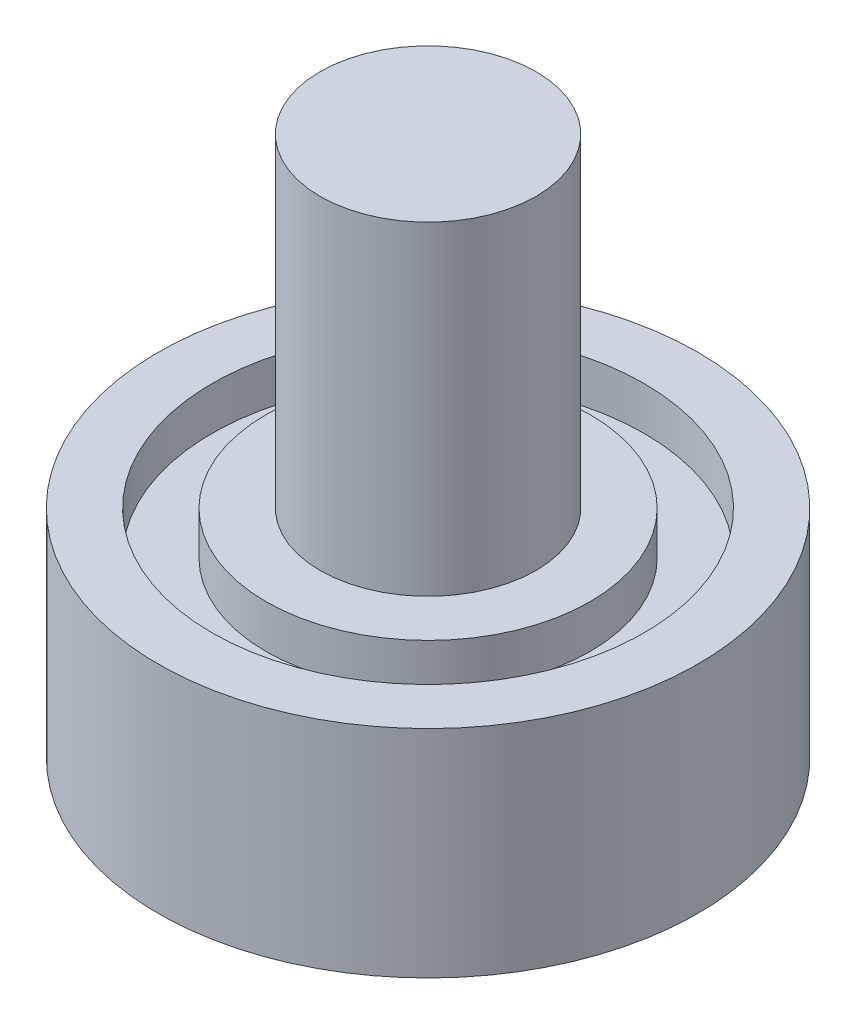
ISO-10303-21;
HEADER;
FILE_DESCRIPTION(('STEP AP214'),'2;1');
FILE_NAME('part.step','',(''),(''),'','','');
FILE_SCHEMA(('AUTOMOTIVE_DESIGN { 1 0 10303 214 1 1 1 1 }'));
ENDSEC;
DATA;
#1=APPLICATION_CONTEXT('core data for automotive mechanical design processes');
#2=APPLICATION_PROTOCOL_DEFINITION('international standard','automotive_design',2000,#1);
#3=PRODUCT_CONTEXT('',#1,'mechanical');
#4=PRODUCT('Part','Part','',(#3));
#5=PRODUCT_RELATED_PRODUCT_CATEGORY('part','',(#4));
#6=PRODUCT_DEFINITION_FORMATION('','',#4);
#7=PRODUCT_DEFINITION_CONTEXT('part definition',#1,'design');
#8=PRODUCT_DEFINITION('design','',#6,#7);
#9=PRODUCT_DEFINITION_SHAPE('','',#8);
#10=(LENGTH_UNIT() NAMED_UNIT(*) SI_UNIT(.MILLI.,.METRE.));
#11=(NAMED_UNIT(*) PLANE_ANGLE_UNIT() SI_UNIT($,.RADIAN.));
#12=(NAMED_UNIT(*) SI_UNIT($,.STERADIAN.) SOLID_ANGLE_UNIT());
#13=UNCERTAINTY_MEASURE_WITH_UNIT(LENGTH_MEASURE(1.E-05),#10,'distance_accuracy_value','');
#14=(GEOMETRIC_REPRESENTATION_CONTEXT(3) GLOBAL_UNCERTAINTY_ASSIGNED_CONTEXT((#13)) GLOBAL_UNIT_ASSIGNED_CONTEXT((#10,
#11,#12)) REPRESENTATION_CONTEXT('',''));
#15=CARTESIAN_POINT('',(0.,0.,0.));
#16=DIRECTION('',(0.,0.,1.));
#17=DIRECTION('',(1.,0.,0.));
#18=AXIS2_PLACEMENT_3D('',#15,#16,#17);
#19=CARTESIAN_POINT('',(0.,29.,0.));
#20=DIRECTION('',(0.,1.,0.));
#21=DIRECTION('',(0.,0.,1.));
#22=AXIS2_PLACEMENT_3D('',#19,#20,#21);
#23=PLANE('',#22);
#24=CARTESIAN_POINT('',(0.,29.,0.));
#25=DIRECTION('',(0.,-1.,0.));
#26=DIRECTION('',(0.,0.,-1.));
#27=AXIS2_PLACEMENT_3D('',#24,#25,#26);
#28=CIRCLE('',#27,5.);
#29=CARTESIAN_POINT('',(0.,29.,-5.));
#30=VERTEX_POINT('',#29);
#31=EDGE_CURVE('E37',#30,#30,#28,.T.);
#32=ORIENTED_EDGE('',*,*,#31,.F.);
#33=EDGE_LOOP('',(#32));
#34=FACE_BOUND('',#33,.T.);
#35=ADVANCED_FACE('F31',(#34),#23,.T.);
#36=CARTESIAN_POINT('',(0.,0.,0.));
#37=DIRECTION('',(0.,-1.,0.));
#38=DIRECTION('',(0.,0.,-1.));
#39=AXIS2_PLACEMENT_3D('',#36,#37,#38);
#40=CYLINDRICAL_SURFACE('',#39,5.);
#41=ORIENTED_EDGE('',*,*,#31,.T.);
#42=EDGE_LOOP('',(#41));
#43=FACE_BOUND('',#42,.T.);
#44=CARTESIAN_POINT('',(0.,14.,0.));
#45=DIRECTION('',(0.,-1.,0.));
#46=DIRECTION('',(0.,0.,-1.));
#47=AXIS2_PLACEMENT_3D('',#44,#45,#46);
#48=CIRCLE('',#47,5.);
#49=CARTESIAN_POINT('',(0.,14.,-5.));
#50=VERTEX_POINT('',#49);
#51=EDGE_CURVE('E41',#50,#50,#48,.T.);
#52=ORIENTED_EDGE('',*,*,#51,.F.);
#53=EDGE_LOOP('',(#52));
#54=FACE_BOUND('',#53,.T.);
#55=ADVANCED_FACE('F113',(#43,#54),#40,.T.);
#56=CARTESIAN_POINT('',(7.5,14.,0.));
#57=DIRECTION('',(0.,1.,0.));
#58=DIRECTION('',(0.,0.,1.));
#59=AXIS2_PLACEMENT_3D('',#56,#57,#58);
#60=PLANE('',#59);
#61=ORIENTED_EDGE('',*,*,#51,.T.);
#62=EDGE_LOOP('',(#61));
#63=FACE_BOUND('',#62,.T.);
#64=CARTESIAN_POINT('',(0.,14.,0.));
#65=DIRECTION('',(0.,-1.,0.));
#66=DIRECTION('',(0.,0.,-1.));
#67=AXIS2_PLACEMENT_3D('',#64,#65,#66);
#68=CIRCLE('',#67,7.5);
#69=CARTESIAN_POINT('',(0.,14.,-7.5));
#70=VERTEX_POINT('',#69);
#71=EDGE_CURVE('E45',#70,#70,#68,.T.);
#72=ORIENTED_EDGE('',*,*,#71,.F.);
#73=EDGE_LOOP('',(#72));
#74=FACE_BOUND('',#73,.T.);
#75=ADVANCED_FACE('F118',(#63,#74),#60,.T.);
#76=CARTESIAN_POINT('',(0.,0.,0.));
#77=DIRECTION('',(0.,-1.,0.));
#78=DIRECTION('',(0.,0.,-1.));
#79=AXIS2_PLACEMENT_3D('',#76,#77,#78);
#80=CYLINDRICAL_SURFACE('',#79,7.5);
#81=ORIENTED_EDGE('',*,*,#71,.T.);
#82=EDGE_LOOP('',(#81));
#83=FACE_BOUND('',#82,.T.);
#84=CARTESIAN_POINT('',(0.,12.,0.));
#85=DIRECTION('',(0.,-1.,0.));
#86=DIRECTION('',(0.,0.,-1.));
#87=AXIS2_PLACEMENT_3D('',#84,#85,#86);
#88=CIRCLE('',#87,7.5);
#89=CARTESIAN_POINT('',(0.,12.,-7.5));
#90=VERTEX_POINT('',#89);
#91=EDGE_CURVE('E50',#90,#90,#88,.T.);
#92=ORIENTED_EDGE('',*,*,#91,.F.);
#93=EDGE_LOOP('',(#92));
#94=FACE_BOUND('',#93,.T.);
#95=ADVANCED_FACE('F122',(#83,#94),#80,.T.);
#96=CARTESIAN_POINT('',(7.5,12.,0.));
#97=DIRECTION('',(0.,1.,0.));
#98=DIRECTION('',(0.,0.,1.));
#99=AXIS2_PLACEMENT_3D('',#96,#97,#98);
#100=PLANE('',#99);
#101=ORIENTED_EDGE('',*,*,#91,.T.);
#102=EDGE_LOOP('',(#101));
#103=FACE_BOUND('',#102,.T.);
#104=CARTESIAN_POINT('',(0.,12.,0.));
#105=DIRECTION('',(0.,-1.,0.));
#106=DIRECTION('',(0.,0.,-1.));
#107=AXIS2_PLACEMENT_3D('',#104,#105,#106);
#108=CIRCLE('',#107,10.);
#109=CARTESIAN_POINT('',(0.,12.,-10.));
#110=VERTEX_POINT('',#109);
#111=EDGE_CURVE('E53',#110,#110,#108,.T.);
#112=ORIENTED_EDGE('',*,*,#111,.F.);
#113=EDGE_LOOP('',(#112));
#114=FACE_BOUND('',#113,.T.);
#115=ADVANCED_FACE('F129',(#103,#114),#100,.T.);
#116=CARTESIAN_POINT('',(0.,0.,0.));
#117=DIRECTION('',(0.,-1.,0.));
#118=DIRECTION('',(0.,0.,-1.));
#119=AXIS2_PLACEMENT_3D('',#116,#117,#118);
#120=CYLINDRICAL_SURFACE('',#119,10.);
#121=ORIENTED_EDGE('',*,*,#111,.T.);
#122=EDGE_LOOP('',(#121));
#123=FACE_BOUND('',#122,.T.);
#124=CARTESIAN_POINT('',(0.,14.,0.));
#125=DIRECTION('',(0.,-1.,0.));
#126=DIRECTION('',(0.,0.,-1.));
#127=AXIS2_PLACEMENT_3D('',#124,#125,#126);
#128=CIRCLE('',#127,10.);
#129=CARTESIAN_POINT('',(0.,14.,-10.));
#130=VERTEX_POINT('',#129);
#131=EDGE_CURVE('E56',#130,#130,#128,.T.);
#132=ORIENTED_EDGE('',*,*,#131,.F.);
#133=EDGE_LOOP('',(#132));
#134=FACE_BOUND('',#133,.T.);
#135=ADVANCED_FACE('F133',(#123,#134),#120,.F.);
#136=CARTESIAN_POINT('',(10.,14.,0.));
#137=DIRECTION('',(0.,1.,0.));
#138=DIRECTION('',(0.,0.,1.));
#139=AXIS2_PLACEMENT_3D('',#136,#137,#138);
#140=PLANE('',#139);
#141=ORIENTED_EDGE('',*,*,#131,.T.);
#142=EDGE_LOOP('',(#141));
#143=FACE_BOUND('',#142,.T.);
#144=CARTESIAN_POINT('',(0.,14.,0.));
#145=DIRECTION('',(0.,-1.,0.));
#146=DIRECTION('',(0.,0.,-1.));
#147=AXIS2_PLACEMENT_3D('',#144,#145,#146);
#148=CIRCLE('',#147,12.4976696084453);
#149=CARTESIAN_POINT('',(0.,14.,-12.4976696084453));
#150=VERTEX_POINT('',#149);
#151=EDGE_CURVE('E59',#150,#150,#148,.T.);
#152=ORIENTED_EDGE('',*,*,#151,.F.);
#153=EDGE_LOOP('',(#152));
#154=FACE_BOUND('',#153,.T.);
#155=ADVANCED_FACE('F137',(#143,#154),#140,.T.);
#156=CARTESIAN_POINT('',(0.,0.,0.));
#157=DIRECTION('',(0.,-1.,0.));
#158=DIRECTION('',(0.,0.,-1.));
#159=AXIS2_PLACEMENT_3D('',#156,#157,#158);
#160=CYLINDRICAL_SURFACE('',#159,12.4976696084453);
#161=ORIENTED_EDGE('',*,*,#151,.T.);
#162=EDGE_LOOP('',(#161));
#163=FACE_BOUND('',#162,.T.);
#164=CARTESIAN_POINT('',(0.,4.,0.));
#165=DIRECTION('',(0.,-1.,0.));
#166=DIRECTION('',(0.,0.,-1.));
#167=AXIS2_PLACEMENT_3D('',#164,#165,#166);
#168=CIRCLE('',#167,12.4976696084453);
#169=CARTESIAN_POINT('',(0.,4.,-12.4976696084453));
#170=VERTEX_POINT('',#169);
#171=EDGE_CURVE('E62',#170,#170,#168,.T.);
#172=ORIENTED_EDGE('',*,*,#171,.F.);
#173=EDGE_LOOP('',(#172));
#174=FACE_BOUND('',#173,.T.);
#175=ADVANCED_FACE('F141',(#163,#174),#160,.T.);
#176=CARTESIAN_POINT('',(10.,4.,0.));
#177=DIRECTION('',(0.,-1.,0.));
#178=DIRECTION('',(0.,0.,-1.));
#179=AXIS2_PLACEMENT_3D('',#176,#177,#178);
#180=PLANE('',#179);
#181=ORIENTED_EDGE('',*,*,#171,.T.);
#182=EDGE_LOOP('',(#181));
#183=FACE_BOUND('',#182,.T.);
#184=CARTESIAN_POINT('',(0.,4.,0.));
#185=DIRECTION('',(0.,-1.,0.));
#186=DIRECTION('',(0.,0.,-1.));
#187=AXIS2_PLACEMENT_3D('',#184,#185,#186);
#188=CIRCLE('',#187,10.);
#189=CARTESIAN_POINT('',(0.,4.,-10.));
#190=VERTEX_POINT('',#189);
#191=EDGE_CURVE('E65',#190,#190,#188,.T.);
#192=ORIENTED_EDGE('',*,*,#191,.F.);
#193=EDGE_LOOP('',(#192));
#194=FACE_BOUND('',#193,.T.);
#195=ADVANCED_FACE('F145',(#183,#194),#180,.T.);
#196=CARTESIAN_POINT('',(0.,0.,0.));
#197=DIRECTION('',(0.,-1.,0.));
#198=DIRECTION('',(0.,0.,-1.));
#199=AXIS2_PLACEMENT_3D('',#196,#197,#198);
#200=CYLINDRICAL_SURFACE('',#199,10.);
#201=ORIENTED_EDGE('',*,*,#191,.T.);
#202=EDGE_LOOP('',(#201));
#203=FACE_BOUND('',#202,.T.);
#204=CARTESIAN_POINT('',(0.,6.,0.));
#205=DIRECTION('',(0.,-1.,0.));
#206=DIRECTION('',(0.,0.,-1.));
#207=AXIS2_PLACEMENT_3D('',#204,#205,#206);
#208=CIRCLE('',#207,10.);
#209=CARTESIAN_POINT('',(0.,6.,-10.));
#210=VERTEX_POINT('',#209);
#211=EDGE_CURVE('E68',#210,#210,#208,.T.);
#212=ORIENTED_EDGE('',*,*,#211,.F.);
#213=EDGE_LOOP('',(#212));
#214=FACE_BOUND('',#213,.T.);
#215=ADVANCED_FACE('F109',(#203,#214),#200,.F.);
#216=CARTESIAN_POINT('',(7.5,6.,0.));
#217=DIRECTION('',(0.,-1.,0.));
#218=DIRECTION('',(0.,0.,-1.));
#219=AXIS2_PLACEMENT_3D('',#216,#217,#218);
#220=PLANE('',#219);
#221=ORIENTED_EDGE('',*,*,#211,.T.);
#222=EDGE_LOOP('',(#221));
#223=FACE_BOUND('',#222,.T.);
#224=CARTESIAN_POINT('',(0.,6.,0.));
#225=DIRECTION('',(0.,-1.,0.));
#226=DIRECTION('',(0.,0.,-1.));
#227=AXIS2_PLACEMENT_3D('',#224,#225,#226);
#228=CIRCLE('',#227,7.5);
#229=CARTESIAN_POINT('',(0.,6.,-7.5));
#230=VERTEX_POINT('',#229);
#231=EDGE_CURVE('E71',#230,#230,#228,.T.);
#232=ORIENTED_EDGE('',*,*,#231,.F.);
#233=EDGE_LOOP('',(#232));
#234=FACE_BOUND('',#233,.T.);
#235=ADVANCED_FACE('F103',(#223,#234),#220,.T.);
#236=CARTESIAN_POINT('',(0.,0.,0.));
#237=DIRECTION('',(0.,-1.,0.));
#238=DIRECTION('',(0.,0.,-1.));
#239=AXIS2_PLACEMENT_3D('',#236,#237,#238);
#240=CYLINDRICAL_SURFACE('',#239,7.5);
#241=ORIENTED_EDGE('',*,*,#231,.T.);
#242=EDGE_LOOP('',(#241));
#243=FACE_BOUND('',#242,.T.);
#244=CARTESIAN_POINT('',(0.,4.,0.));
#245=DIRECTION('',(0.,-1.,0.));
#246=DIRECTION('',(0.,0.,-1.));
#247=AXIS2_PLACEMENT_3D('',#244,#245,#246);
#248=CIRCLE('',#247,7.5);
#249=CARTESIAN_POINT('',(0.,4.,-7.5));
#250=VERTEX_POINT('',#249);
#251=EDGE_CURVE('E74',#250,#250,#248,.T.);
#252=ORIENTED_EDGE('',*,*,#251,.F.);
#253=EDGE_LOOP('',(#252));
#254=FACE_BOUND('',#253,.T.);
#255=ADVANCED_FACE('F98',(#243,#254),#240,.T.);
#256=CARTESIAN_POINT('',(2.5,4.,0.));
#257=DIRECTION('',(0.,-1.,0.));
#258=DIRECTION('',(0.,0.,-1.));
#259=AXIS2_PLACEMENT_3D('',#256,#257,#258);
#260=PLANE('',#259);
#261=CARTESIAN_POINT('',(0.,4.,0.));
#262=DIRECTION('',(0.,-1.,0.));
#263=DIRECTION('',(0.,0.,-1.));
#264=AXIS2_PLACEMENT_3D('',#261,#262,#263);
#265=CIRCLE('',#264,3.);
#266=CARTESIAN_POINT('',(0.,4.,-3.));
#267=VERTEX_POINT('',#266);
#268=EDGE_CURVE('E81',#267,#267,#265,.T.);
#269=ORIENTED_EDGE('',*,*,#268,.F.);
#270=EDGE_LOOP('',(#269));
#271=FACE_BOUND('',#270,.T.);
#272=ORIENTED_EDGE('',*,*,#251,.T.);
#273=EDGE_LOOP('',(#272));
#274=FACE_BOUND('',#273,.T.);
#275=ADVANCED_FACE('F92',(#271,#274),#260,.T.);
#276=CARTESIAN_POINT('',(0.,3.,0.));
#277=DIRECTION('',(0.,1.,0.));
#278=DIRECTION('',(0.,0.,1.));
#279=AXIS2_PLACEMENT_3D('',#276,#277,#278);
#280=CYLINDRICAL_SURFACE('',#279,3.);
#281=CARTESIAN_POINT('',(0.,3.,0.));
#282=DIRECTION('',(0.,-1.,0.));
#283=DIRECTION('',(0.,0.,-1.));
#284=AXIS2_PLACEMENT_3D('',#281,#282,#283);
#285=CIRCLE('',#284,3.);
#286=CARTESIAN_POINT('',(0.,3.,-3.));
#287=VERTEX_POINT('',#286);
#288=EDGE_CURVE('E80',#287,#287,#285,.T.);
#289=ORIENTED_EDGE('',*,*,#288,.F.);
#290=EDGE_LOOP('',(#289));
#291=FACE_BOUND('',#290,.T.);
#292=ORIENTED_EDGE('',*,*,#268,.T.);
#293=EDGE_LOOP('',(#292));
#294=FACE_BOUND('',#293,.T.);
#295=ADVANCED_FACE('F89',(#291,#294),#280,.T.);
#296=CARTESIAN_POINT('',(0.,3.,0.));
#297=DIRECTION('',(0.,-1.,0.));
#298=DIRECTION('',(0.,0.,-1.));
#299=AXIS2_PLACEMENT_3D('',#296,#297,#298);
#300=PLANE('',#299);
#301=CARTESIAN_POINT('',(0.,3.,0.));
#302=DIRECTION('',(0.,-1.,0.));
#303=DIRECTION('',(0.,0.,-1.));
#304=AXIS2_PLACEMENT_3D('',#301,#302,#303);
#305=CIRCLE('',#304,2.5);
#306=CARTESIAN_POINT('',(0.,3.,-2.5));
#307=VERTEX_POINT('',#306);
#308=EDGE_CURVE('E10',#307,#307,#305,.F.);
#309=ORIENTED_EDGE('',*,*,#308,.T.);
#310=EDGE_LOOP('',(#309));
#311=FACE_BOUND('',#310,.T.);
#312=ORIENTED_EDGE('',*,*,#288,.T.);
#313=EDGE_LOOP('',(#312));
#314=FACE_BOUND('',#313,.T.);
#315=ADVANCED_FACE('F87',(#311,#314),#300,.T.);
#316=CARTESIAN_POINT('',(0.,0.,0.));
#317=DIRECTION('',(0.,-1.,0.));
#318=DIRECTION('',(0.,0.,-1.));
#319=AXIS2_PLACEMENT_3D('',#316,#317,#318);
#320=PLANE('',#319);
#321=CARTESIAN_POINT('',(0.,0.,0.));
#322=DIRECTION('',(0.,-1.,0.));
#323=DIRECTION('',(0.,0.,-1.));
#324=AXIS2_PLACEMENT_3D('',#321,#322,#323);
#325=CIRCLE('',#324,2.5);
#326=CARTESIAN_POINT('',(0.,0.,-2.5));
#327=VERTEX_POINT('',#326);
#328=EDGE_CURVE('E77',#327,#327,#325,.T.);
#329=ORIENTED_EDGE('',*,*,#328,.T.);
#330=EDGE_LOOP('',(#329));
#331=FACE_BOUND('',#330,.T.);
#332=ADVANCED_FACE('F176',(#331),#320,.T.);
#333=CARTESIAN_POINT('',(0.,0.,0.));
#334=DIRECTION('',(0.,-1.,0.));
#335=DIRECTION('',(0.,0.,-1.));
#336=AXIS2_PLACEMENT_3D('',#333,#334,#335);
#337=CYLINDRICAL_SURFACE('',#336,2.5);
#338=ORIENTED_EDGE('',*,*,#308,.F.);
#339=EDGE_LOOP('',(#338));
#340=FACE_BOUND('',#339,.T.);
#341=ORIENTED_EDGE('',*,*,#328,.F.);
#342=EDGE_LOOP('',(#341));
#343=FACE_BOUND('',#342,.T.);
#344=ADVANCED_FACE('F181',(#340,#343),#337,.T.);
#345=CLOSED_SHELL('',(#35,#55,#75,#95,#115,#135,#155,#175,#195,#215,#235,#255,#275,#295,#315,
#332,#344));
#346=MANIFOLD_SOLID_BREP('B2',#345);
#347=ADVANCED_BREP_SHAPE_REPRESENTATION('',(#18,#346),#14);
#348=SHAPE_DEFINITION_REPRESENTATION(#9,#347);
ENDSEC;
END-ISO-10303-21;
